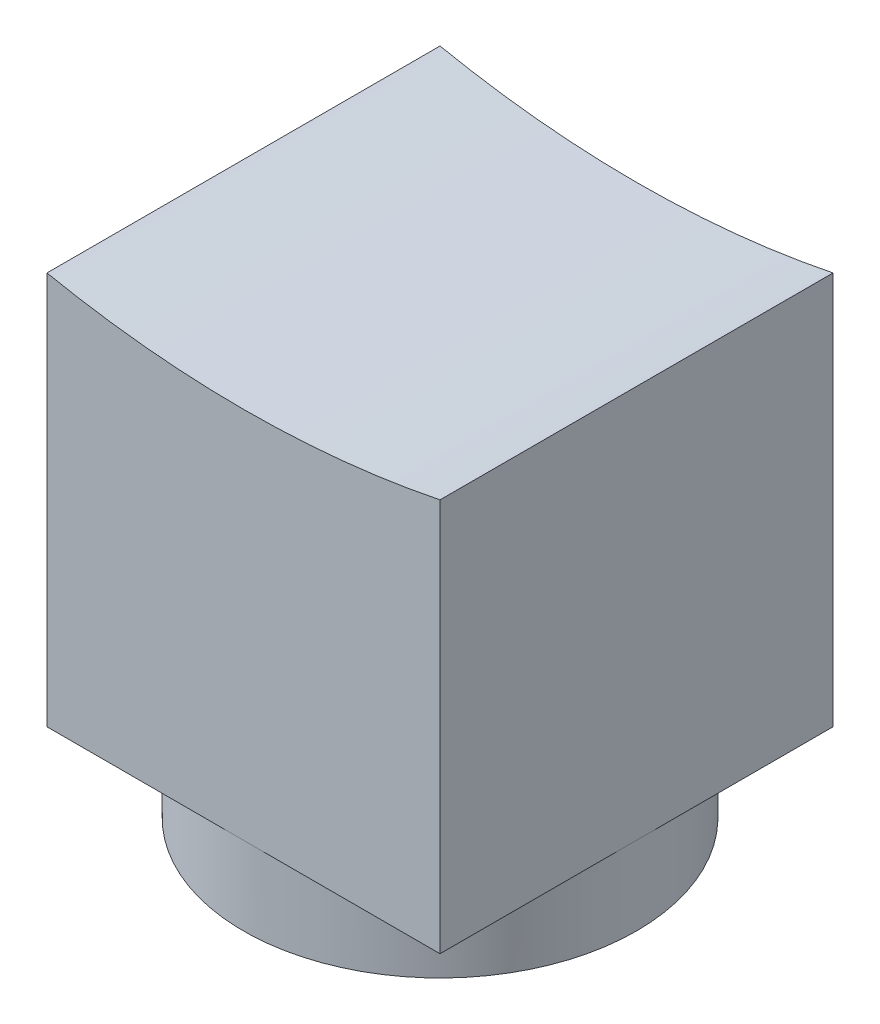
ISO-10303-21;
HEADER;
FILE_DESCRIPTION(('STEP AP214'),'2;1');
FILE_NAME('part.step','',(''),(''),'','','');
FILE_SCHEMA(('AUTOMOTIVE_DESIGN { 1 0 10303 214 1 1 1 1 }'));
ENDSEC;
DATA;
#1=APPLICATION_CONTEXT('core data for automotive mechanical design processes');
#2=APPLICATION_PROTOCOL_DEFINITION('international standard','automotive_design',2000,#1);
#3=PRODUCT_CONTEXT('',#1,'mechanical');
#4=PRODUCT('Part','Part','',(#3));
#5=PRODUCT_RELATED_PRODUCT_CATEGORY('part','',(#4));
#6=PRODUCT_DEFINITION_FORMATION('','',#4);
#7=PRODUCT_DEFINITION_CONTEXT('part definition',#1,'design');
#8=PRODUCT_DEFINITION('design','',#6,#7);
#9=PRODUCT_DEFINITION_SHAPE('','',#8);
#10=(LENGTH_UNIT() NAMED_UNIT(*) SI_UNIT(.MILLI.,.METRE.));
#11=(NAMED_UNIT(*) PLANE_ANGLE_UNIT() SI_UNIT($,.RADIAN.));
#12=(NAMED_UNIT(*) SI_UNIT($,.STERADIAN.) SOLID_ANGLE_UNIT());
#13=UNCERTAINTY_MEASURE_WITH_UNIT(LENGTH_MEASURE(1.E-05),#10,'distance_accuracy_value','');
#14=(GEOMETRIC_REPRESENTATION_CONTEXT(3) GLOBAL_UNCERTAINTY_ASSIGNED_CONTEXT((#13)) GLOBAL_UNIT_ASSIGNED_CONTEXT((#10,
#11,#12)) REPRESENTATION_CONTEXT('',''));
#15=CARTESIAN_POINT('',(0.,0.,0.));
#16=DIRECTION('',(0.,0.,1.));
#17=DIRECTION('',(1.,0.,0.));
#18=AXIS2_PLACEMENT_3D('',#15,#16,#17);
#19=CARTESIAN_POINT('',(25.,-25.,50.));
#20=DIRECTION('',(0.,1.,0.));
#21=DIRECTION('',(-1.,0.,0.));
#22=AXIS2_PLACEMENT_3D('',#19,#20,#21);
#23=PLANE('',#22);
#24=CARTESIAN_POINT('',(0.,-25.,25.));
#25=DIRECTION('',(0.,-1.,0.));
#26=DIRECTION('',(1.,0.,0.));
#27=AXIS2_PLACEMENT_3D('',#24,#25,#26);
#28=CIRCLE('',#27,25.);
#29=CARTESIAN_POINT('',(25.,-25.,25.));
#30=VERTEX_POINT('',#29);
#31=CARTESIAN_POINT('',(0.,-25.,50.));
#32=VERTEX_POINT('',#31);
#33=EDGE_CURVE('E44',#30,#32,#28,.T.);
#34=ORIENTED_EDGE('',*,*,#33,.F.);
#35=DIRECTION('',(0.,0.,-1.));
#36=VECTOR('',#35,1.);
#37=CARTESIAN_POINT('',(25.,-25.,50.));
#38=LINE('',#37,#36);
#39=CARTESIAN_POINT('',(25.,-25.,50.));
#40=VERTEX_POINT('',#39);
#41=EDGE_CURVE('E88',#40,#30,#38,.T.);
#42=ORIENTED_EDGE('',*,*,#41,.F.);
#43=DIRECTION('',(1.,0.,0.));
#44=VECTOR('',#43,1.);
#45=CARTESIAN_POINT('',(25.,-25.,50.));
#46=LINE('',#45,#44);
#47=EDGE_CURVE('E107',#32,#40,#46,.T.);
#48=ORIENTED_EDGE('',*,*,#47,.F.);
#49=EDGE_LOOP('',(#34,#42,#48));
#50=FACE_BOUND('',#49,.T.);
#51=ADVANCED_FACE('F33',(#50),#23,.F.);
#52=CARTESIAN_POINT('',(-25.,-25.,25.));
#53=VERTEX_POINT('',#52);
#54=EDGE_CURVE('E11',#32,#53,#28,.T.);
#55=ORIENTED_EDGE('',*,*,#54,.F.);
#56=CARTESIAN_POINT('',(-25.,-25.,50.));
#57=VERTEX_POINT('',#56);
#58=EDGE_CURVE('E118',#57,#32,#46,.T.);
#59=ORIENTED_EDGE('',*,*,#58,.F.);
#60=DIRECTION('',(0.,0.,-1.));
#61=VECTOR('',#60,1.);
#62=CARTESIAN_POINT('',(-25.,-25.,50.));
#63=LINE('',#62,#61);
#64=EDGE_CURVE('E37',#57,#53,#63,.T.);
#65=ORIENTED_EDGE('',*,*,#64,.T.);
#66=EDGE_LOOP('',(#55,#59,#65));
#67=FACE_BOUND('',#66,.T.);
#68=ADVANCED_FACE('F149',(#67),#23,.F.);
#69=CARTESIAN_POINT('',(0.,-25.,0.));
#70=VERTEX_POINT('',#69);
#71=EDGE_CURVE('E42',#53,#70,#28,.T.);
#72=ORIENTED_EDGE('',*,*,#71,.F.);
#73=CARTESIAN_POINT('',(-25.,-25.,0.));
#74=VERTEX_POINT('',#73);
#75=EDGE_CURVE('E97',#53,#74,#63,.T.);
#76=ORIENTED_EDGE('',*,*,#75,.T.);
#77=DIRECTION('',(1.,0.,0.));
#78=VECTOR('',#77,1.);
#79=CARTESIAN_POINT('',(25.,-25.,0.));
#80=LINE('',#79,#78);
#81=EDGE_CURVE('E127',#74,#70,#80,.T.);
#82=ORIENTED_EDGE('',*,*,#81,.T.);
#83=EDGE_LOOP('',(#72,#76,#82));
#84=FACE_BOUND('',#83,.T.);
#85=ADVANCED_FACE('F151',(#84),#23,.F.);
#86=CARTESIAN_POINT('',(-25.,25.,50.));
#87=DIRECTION('',(1.,0.,0.));
#88=DIRECTION('',(0.,1.,0.));
#89=AXIS2_PLACEMENT_3D('',#86,#87,#88);
#90=PLANE('',#89);
#91=DIRECTION('',(0.,-1.,0.));
#92=VECTOR('',#91,1.);
#93=CARTESIAN_POINT('',(-25.,25.,0.));
#94=LINE('',#93,#92);
#95=CARTESIAN_POINT('',(-25.,25.,0.));
#96=VERTEX_POINT('',#95);
#97=EDGE_CURVE('E124',#96,#74,#94,.T.);
#98=ORIENTED_EDGE('',*,*,#97,.T.);
#99=ORIENTED_EDGE('',*,*,#75,.F.);
#100=ORIENTED_EDGE('',*,*,#64,.F.);
#101=DIRECTION('',(0.,-1.,0.));
#102=VECTOR('',#101,1.);
#103=CARTESIAN_POINT('',(-25.,25.,50.));
#104=LINE('',#103,#102);
#105=CARTESIAN_POINT('',(-25.,25.,50.));
#106=VERTEX_POINT('',#105);
#107=EDGE_CURVE('E114',#106,#57,#104,.T.);
#108=ORIENTED_EDGE('',*,*,#107,.F.);
#109=DIRECTION('',(0.,0.,-1.));
#110=VECTOR('',#109,1.);
#111=CARTESIAN_POINT('',(-25.,25.,50.));
#112=LINE('',#111,#110);
#113=EDGE_CURVE('E123',#106,#96,#112,.T.);
#114=ORIENTED_EDGE('',*,*,#113,.T.);
#115=EDGE_LOOP('',(#98,#99,#100,#108,#114));
#116=FACE_BOUND('',#115,.T.);
#117=ADVANCED_FACE('F35',(#116),#90,.F.);
#118=EDGE_CURVE('E101',#70,#30,#28,.T.);
#119=ORIENTED_EDGE('',*,*,#118,.F.);
#120=CARTESIAN_POINT('',(25.,-25.,0.));
#121=VERTEX_POINT('',#120);
#122=EDGE_CURVE('E103',#70,#121,#80,.T.);
#123=ORIENTED_EDGE('',*,*,#122,.T.);
#124=EDGE_CURVE('E91',#30,#121,#38,.T.);
#125=ORIENTED_EDGE('',*,*,#124,.F.);
#126=EDGE_LOOP('',(#119,#123,#125));
#127=FACE_BOUND('',#126,.T.);
#128=ADVANCED_FACE('F99',(#127),#23,.F.);
#129=CARTESIAN_POINT('',(25.,25.,50.));
#130=DIRECTION('',(-1.,0.,0.));
#131=DIRECTION('',(0.,-1.,0.));
#132=AXIS2_PLACEMENT_3D('',#129,#130,#131);
#133=PLANE('',#132);
#134=DIRECTION('',(0.,1.,0.));
#135=VECTOR('',#134,1.);
#136=CARTESIAN_POINT('',(25.,25.,0.));
#137=LINE('',#136,#135);
#138=CARTESIAN_POINT('',(25.,25.,0.));
#139=VERTEX_POINT('',#138);
#140=EDGE_CURVE('E129',#121,#139,#137,.T.);
#141=ORIENTED_EDGE('',*,*,#140,.T.);
#142=DIRECTION('',(0.,0.,-1.));
#143=VECTOR('',#142,1.);
#144=CARTESIAN_POINT('',(25.,25.,50.));
#145=LINE('',#144,#143);
#146=CARTESIAN_POINT('',(25.,25.,50.));
#147=VERTEX_POINT('',#146);
#148=EDGE_CURVE('E105',#147,#139,#145,.T.);
#149=ORIENTED_EDGE('',*,*,#148,.F.);
#150=DIRECTION('',(0.,1.,0.));
#151=VECTOR('',#150,1.);
#152=CARTESIAN_POINT('',(25.,25.,50.));
#153=LINE('',#152,#151);
#154=EDGE_CURVE('E94',#40,#147,#153,.T.);
#155=ORIENTED_EDGE('',*,*,#154,.F.);
#156=ORIENTED_EDGE('',*,*,#41,.T.);
#157=ORIENTED_EDGE('',*,*,#124,.T.);
#158=EDGE_LOOP('',(#141,#149,#155,#156,#157));
#159=FACE_BOUND('',#158,.T.);
#160=ADVANCED_FACE('F90',(#159),#133,.F.);
#161=CARTESIAN_POINT('',(0.,147.468363408678,50.));
#162=DIRECTION('',(0.,0.,-1.));
#163=DIRECTION('',(-1.,0.,0.));
#164=AXIS2_PLACEMENT_3D('',#161,#162,#163);
#165=CYLINDRICAL_SURFACE('',#164,124.994);
#166=CARTESIAN_POINT('',(0.,147.468363408678,0.));
#167=DIRECTION('',(0.,0.,-1.));
#168=DIRECTION('',(1.,0.,0.));
#169=AXIS2_PLACEMENT_3D('',#166,#167,#168);
#170=CIRCLE('',#169,124.994);
#171=EDGE_CURVE('E117',#139,#96,#170,.T.);
#172=ORIENTED_EDGE('',*,*,#171,.T.);
#173=ORIENTED_EDGE('',*,*,#113,.F.);
#174=CARTESIAN_POINT('',(0.,147.468363408678,50.));
#175=DIRECTION('',(0.,0.,-1.));
#176=DIRECTION('',(1.,0.,0.));
#177=AXIS2_PLACEMENT_3D('',#174,#175,#176);
#178=CIRCLE('',#177,124.994);
#179=EDGE_CURVE('E121',#147,#106,#178,.T.);
#180=ORIENTED_EDGE('',*,*,#179,.F.);
#181=ORIENTED_EDGE('',*,*,#148,.T.);
#182=EDGE_LOOP('',(#172,#173,#180,#181));
#183=FACE_BOUND('',#182,.T.);
#184=ADVANCED_FACE('F138',(#183),#165,.F.);
#185=CARTESIAN_POINT('',(0.,147.468363408678,50.));
#186=DIRECTION('',(0.,0.,1.));
#187=DIRECTION('',(1.,0.,0.));
#188=AXIS2_PLACEMENT_3D('',#185,#186,#187);
#189=PLANE('',#188);
#190=ORIENTED_EDGE('',*,*,#107,.T.);
#191=ORIENTED_EDGE('',*,*,#58,.T.);
#192=ORIENTED_EDGE('',*,*,#47,.T.);
#193=ORIENTED_EDGE('',*,*,#154,.T.);
#194=ORIENTED_EDGE('',*,*,#179,.T.);
#195=EDGE_LOOP('',(#190,#191,#192,#193,#194));
#196=FACE_BOUND('',#195,.T.);
#197=ADVANCED_FACE('F148',(#196),#189,.T.);
#198=CARTESIAN_POINT('',(0.,147.468363408678,0.));
#199=DIRECTION('',(0.,0.,1.));
#200=DIRECTION('',(1.,0.,0.));
#201=AXIS2_PLACEMENT_3D('',#198,#199,#200);
#202=PLANE('',#201);
#203=ORIENTED_EDGE('',*,*,#97,.F.);
#204=ORIENTED_EDGE('',*,*,#171,.F.);
#205=ORIENTED_EDGE('',*,*,#140,.F.);
#206=ORIENTED_EDGE('',*,*,#122,.F.);
#207=ORIENTED_EDGE('',*,*,#81,.F.);
#208=EDGE_LOOP('',(#203,#204,#205,#206,#207));
#209=FACE_BOUND('',#208,.T.);
#210=ADVANCED_FACE('F142',(#209),#202,.F.);
#211=CARTESIAN_POINT('',(0.,-35.,25.));
#212=DIRECTION('',(0.,1.,0.));
#213=DIRECTION('',(-1.,0.,0.));
#214=AXIS2_PLACEMENT_3D('',#211,#212,#213);
#215=CYLINDRICAL_SURFACE('',#214,25.);
#216=CARTESIAN_POINT('',(0.,-35.,25.));
#217=DIRECTION('',(0.,-1.,0.));
#218=DIRECTION('',(1.,0.,0.));
#219=AXIS2_PLACEMENT_3D('',#216,#217,#218);
#220=CIRCLE('',#219,25.);
#221=CARTESIAN_POINT('',(25.,-35.,25.));
#222=VERTEX_POINT('',#221);
#223=EDGE_CURVE('E110',#222,#222,#220,.T.);
#224=ORIENTED_EDGE('',*,*,#223,.F.);
#225=EDGE_LOOP('',(#224));
#226=FACE_BOUND('',#225,.T.);
#227=ORIENTED_EDGE('',*,*,#33,.T.);
#228=ORIENTED_EDGE('',*,*,#54,.T.);
#229=ORIENTED_EDGE('',*,*,#71,.T.);
#230=ORIENTED_EDGE('',*,*,#118,.T.);
#231=EDGE_LOOP('',(#227,#228,#229,#230));
#232=FACE_BOUND('',#231,.T.);
#233=ADVANCED_FACE('F111',(#226,#232),#215,.T.);
#234=CARTESIAN_POINT('',(0.,-35.,25.));
#235=DIRECTION('',(0.,-1.,0.));
#236=DIRECTION('',(1.,0.,0.));
#237=AXIS2_PLACEMENT_3D('',#234,#235,#236);
#238=PLANE('',#237);
#239=ORIENTED_EDGE('',*,*,#223,.T.);
#240=EDGE_LOOP('',(#239));
#241=FACE_BOUND('',#240,.T.);
#242=ADVANCED_FACE('F168',(#241),#238,.T.);
#243=CLOSED_SHELL('',(#51,#68,#85,#117,#128,#160,#184,#197,#210,#233,#242));
#244=MANIFOLD_SOLID_BREP('B2',#243);
#245=ADVANCED_BREP_SHAPE_REPRESENTATION('',(#18,#244),#14);
#246=SHAPE_DEFINITION_REPRESENTATION(#9,#245);
ENDSEC;
END-ISO-10303-21;
